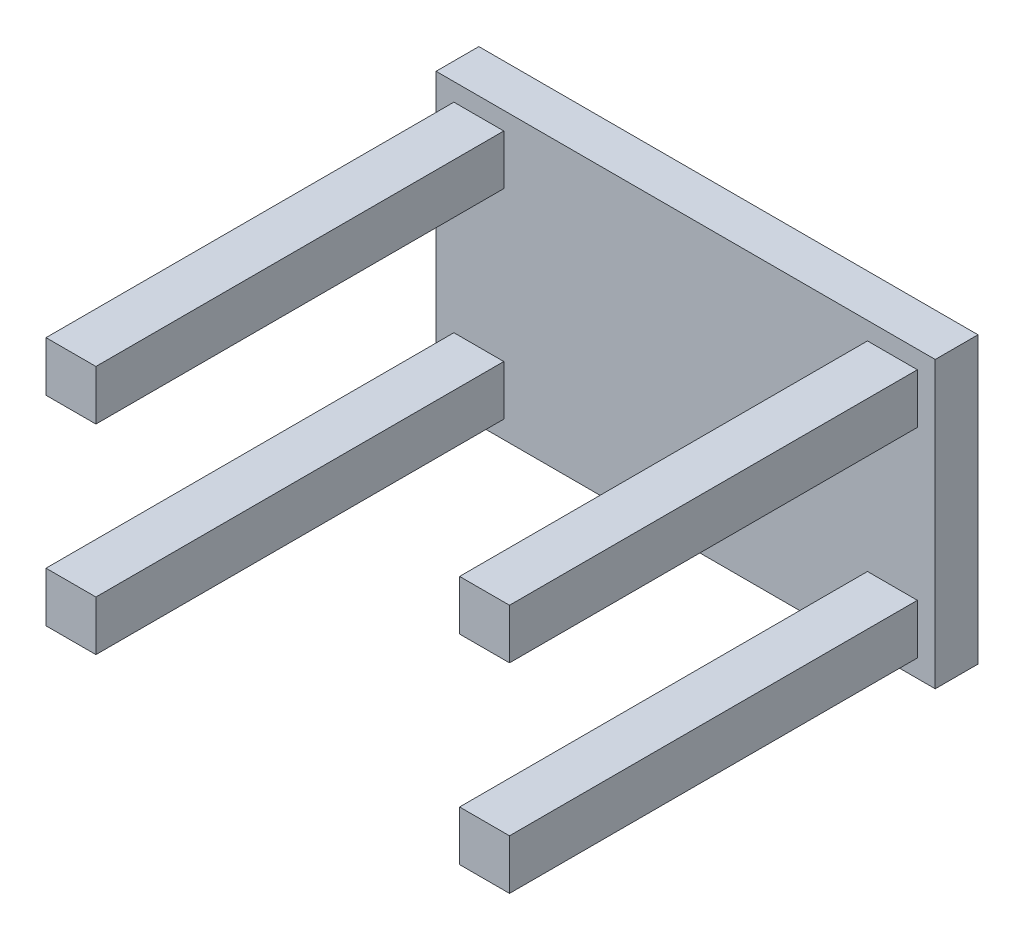
ISO-10303-21;
HEADER;
FILE_DESCRIPTION(('STEP AP214'),'2;1');
FILE_NAME('part.step','',(''),(''),'','','');
FILE_SCHEMA(('AUTOMOTIVE_DESIGN { 1 0 10303 214 1 1 1 1 }'));
ENDSEC;
DATA;
#1=APPLICATION_CONTEXT('core data for automotive mechanical design processes');
#2=APPLICATION_PROTOCOL_DEFINITION('international standard','automotive_design',2000,#1);
#3=PRODUCT_CONTEXT('',#1,'mechanical');
#4=PRODUCT('Part','Part','',(#3));
#5=PRODUCT_RELATED_PRODUCT_CATEGORY('part','',(#4));
#6=PRODUCT_DEFINITION_FORMATION('','',#4);
#7=PRODUCT_DEFINITION_CONTEXT('part definition',#1,'design');
#8=PRODUCT_DEFINITION('design','',#6,#7);
#9=PRODUCT_DEFINITION_SHAPE('','',#8);
#10=(LENGTH_UNIT() NAMED_UNIT(*) SI_UNIT(.MILLI.,.METRE.));
#11=(NAMED_UNIT(*) PLANE_ANGLE_UNIT() SI_UNIT($,.RADIAN.));
#12=(NAMED_UNIT(*) SI_UNIT($,.STERADIAN.) SOLID_ANGLE_UNIT());
#13=UNCERTAINTY_MEASURE_WITH_UNIT(LENGTH_MEASURE(1.E-05),#10,'distance_accuracy_value','');
#14=(GEOMETRIC_REPRESENTATION_CONTEXT(3) GLOBAL_UNCERTAINTY_ASSIGNED_CONTEXT((#13)) GLOBAL_UNIT_ASSIGNED_CONTEXT((#10,
#11,#12)) REPRESENTATION_CONTEXT('',''));
#15=CARTESIAN_POINT('',(0.,0.,0.));
#16=DIRECTION('',(0.,0.,1.));
#17=DIRECTION('',(1.,0.,0.));
#18=AXIS2_PLACEMENT_3D('',#15,#16,#17);
#19=CARTESIAN_POINT('',(0.,0.,30.));
#20=DIRECTION('',(0.,0.,-1.));
#21=DIRECTION('',(-1.,0.,0.));
#22=AXIS2_PLACEMENT_3D('',#19,#20,#21);
#23=PLANE('',#22);
#24=DIRECTION('',(0.,1.,0.));
#25=VECTOR('',#24,1.);
#26=CARTESIAN_POINT('',(-127.5,-87.5,30.));
#27=LINE('',#26,#25);
#28=CARTESIAN_POINT('',(-127.5,-87.5,30.));
#29=VERTEX_POINT('',#28);
#30=CARTESIAN_POINT('',(-127.5,-52.5,30.));
#31=VERTEX_POINT('',#30);
#32=EDGE_CURVE('E261',#29,#31,#27,.T.);
#33=ORIENTED_EDGE('',*,*,#32,.F.);
#34=DIRECTION('',(1.,0.,0.));
#35=VECTOR('',#34,1.);
#36=CARTESIAN_POINT('',(-162.5,-87.5,30.));
#37=LINE('',#36,#35);
#38=CARTESIAN_POINT('',(-162.5,-87.5,30.));
#39=VERTEX_POINT('',#38);
#40=EDGE_CURVE('E248',#39,#29,#37,.T.);
#41=ORIENTED_EDGE('',*,*,#40,.F.);
#42=DIRECTION('',(0.,-1.,0.));
#43=VECTOR('',#42,1.);
#44=CARTESIAN_POINT('',(-162.5,-87.5,30.));
#45=LINE('',#44,#43);
#46=CARTESIAN_POINT('',(-162.5,-52.5,30.));
#47=VERTEX_POINT('',#46);
#48=EDGE_CURVE('E252',#47,#39,#45,.T.);
#49=ORIENTED_EDGE('',*,*,#48,.F.);
#50=DIRECTION('',(-1.,0.,0.));
#51=VECTOR('',#50,1.);
#52=CARTESIAN_POINT('',(-162.5,-52.5,30.));
#53=LINE('',#52,#51);
#54=EDGE_CURVE('E257',#31,#47,#53,.T.);
#55=ORIENTED_EDGE('',*,*,#54,.F.);
#56=EDGE_LOOP('',(#33,#41,#49,#55));
#57=FACE_BOUND('',#56,.T.);
#58=DIRECTION('',(0.,1.,0.));
#59=VECTOR('',#58,1.);
#60=CARTESIAN_POINT('',(162.5,52.5,30.));
#61=LINE('',#60,#59);
#62=CARTESIAN_POINT('',(162.5,52.5,30.));
#63=VERTEX_POINT('',#62);
#64=CARTESIAN_POINT('',(162.5,87.5,30.));
#65=VERTEX_POINT('',#64);
#66=EDGE_CURVE('E191',#63,#65,#61,.T.);
#67=ORIENTED_EDGE('',*,*,#66,.F.);
#68=DIRECTION('',(1.,0.,0.));
#69=VECTOR('',#68,1.);
#70=CARTESIAN_POINT('',(127.5,52.5,30.));
#71=LINE('',#70,#69);
#72=CARTESIAN_POINT('',(127.5,52.5,30.));
#73=VERTEX_POINT('',#72);
#74=EDGE_CURVE('E321',#73,#63,#71,.T.);
#75=ORIENTED_EDGE('',*,*,#74,.F.);
#76=DIRECTION('',(0.,-1.,0.));
#77=VECTOR('',#76,1.);
#78=CARTESIAN_POINT('',(127.5,52.5,30.));
#79=LINE('',#78,#77);
#80=CARTESIAN_POINT('',(127.5,87.5,30.));
#81=VERTEX_POINT('',#80);
#82=EDGE_CURVE('E338',#81,#73,#79,.T.);
#83=ORIENTED_EDGE('',*,*,#82,.F.);
#84=DIRECTION('',(-1.,0.,0.));
#85=VECTOR('',#84,1.);
#86=CARTESIAN_POINT('',(127.5,87.5,30.));
#87=LINE('',#86,#85);
#88=EDGE_CURVE('E334',#65,#81,#87,.T.);
#89=ORIENTED_EDGE('',*,*,#88,.F.);
#90=EDGE_LOOP('',(#67,#75,#83,#89));
#91=FACE_BOUND('',#90,.T.);
#92=DIRECTION('',(0.,1.,0.));
#93=VECTOR('',#92,1.);
#94=CARTESIAN_POINT('',(175.,-100.,30.));
#95=LINE('',#94,#93);
#96=CARTESIAN_POINT('',(175.,-100.,30.));
#97=VERTEX_POINT('',#96);
#98=CARTESIAN_POINT('',(175.,100.,30.));
#99=VERTEX_POINT('',#98);
#100=EDGE_CURVE('E361',#97,#99,#95,.T.);
#101=ORIENTED_EDGE('',*,*,#100,.T.);
#102=DIRECTION('',(-1.,0.,0.));
#103=VECTOR('',#102,1.);
#104=CARTESIAN_POINT('',(-175.,100.,30.));
#105=LINE('',#104,#103);
#106=CARTESIAN_POINT('',(-175.,100.,30.));
#107=VERTEX_POINT('',#106);
#108=EDGE_CURVE('E365',#99,#107,#105,.T.);
#109=ORIENTED_EDGE('',*,*,#108,.T.);
#110=DIRECTION('',(0.,-1.,0.));
#111=VECTOR('',#110,1.);
#112=CARTESIAN_POINT('',(-175.,-100.,30.));
#113=LINE('',#112,#111);
#114=CARTESIAN_POINT('',(-175.,-100.,30.));
#115=VERTEX_POINT('',#114);
#116=EDGE_CURVE('E369',#107,#115,#113,.T.);
#117=ORIENTED_EDGE('',*,*,#116,.T.);
#118=DIRECTION('',(1.,0.,0.));
#119=VECTOR('',#118,1.);
#120=CARTESIAN_POINT('',(-175.,-100.,30.));
#121=LINE('',#120,#119);
#122=EDGE_CURVE('E372',#115,#97,#121,.T.);
#123=ORIENTED_EDGE('',*,*,#122,.T.);
#124=EDGE_LOOP('',(#101,#109,#117,#123));
#125=FACE_BOUND('',#124,.T.);
#126=DIRECTION('',(0.,1.,0.));
#127=VECTOR('',#126,1.);
#128=CARTESIAN_POINT('',(162.5,-87.5,30.));
#129=LINE('',#128,#127);
#130=CARTESIAN_POINT('',(162.5,-87.5,30.));
#131=VERTEX_POINT('',#130);
#132=CARTESIAN_POINT('',(162.5,-52.5,30.));
#133=VERTEX_POINT('',#132);
#134=EDGE_CURVE('E180',#131,#133,#129,.T.);
#135=ORIENTED_EDGE('',*,*,#134,.F.);
#136=DIRECTION('',(1.,0.,0.));
#137=VECTOR('',#136,1.);
#138=CARTESIAN_POINT('',(127.5,-87.5,30.));
#139=LINE('',#138,#137);
#140=CARTESIAN_POINT('',(127.5,-87.5,30.));
#141=VERTEX_POINT('',#140);
#142=EDGE_CURVE('E182',#141,#131,#139,.T.);
#143=ORIENTED_EDGE('',*,*,#142,.F.);
#144=DIRECTION('',(0.,-1.,0.));
#145=VECTOR('',#144,1.);
#146=CARTESIAN_POINT('',(127.5,-87.5,30.));
#147=LINE('',#146,#145);
#148=CARTESIAN_POINT('',(127.5,-52.5,30.));
#149=VERTEX_POINT('',#148);
#150=EDGE_CURVE('E203',#149,#141,#147,.T.);
#151=ORIENTED_EDGE('',*,*,#150,.F.);
#152=DIRECTION('',(-1.,0.,0.));
#153=VECTOR('',#152,1.);
#154=CARTESIAN_POINT('',(127.5,-52.5,30.));
#155=LINE('',#154,#153);
#156=EDGE_CURVE('E185',#133,#149,#155,.T.);
#157=ORIENTED_EDGE('',*,*,#156,.F.);
#158=EDGE_LOOP('',(#135,#143,#151,#157));
#159=FACE_BOUND('',#158,.T.);
#160=DIRECTION('',(0.,1.,0.));
#161=VECTOR('',#160,1.);
#162=CARTESIAN_POINT('',(-127.5,52.5,30.));
#163=LINE('',#162,#161);
#164=CARTESIAN_POINT('',(-127.5,52.5,30.));
#165=VERTEX_POINT('',#164);
#166=CARTESIAN_POINT('',(-127.5,87.5,30.));
#167=VERTEX_POINT('',#166);
#168=EDGE_CURVE('E235',#165,#167,#163,.T.);
#169=ORIENTED_EDGE('',*,*,#168,.F.);
#170=DIRECTION('',(1.,0.,0.));
#171=VECTOR('',#170,1.);
#172=CARTESIAN_POINT('',(-162.5,52.5,30.));
#173=LINE('',#172,#171);
#174=CARTESIAN_POINT('',(-162.5,52.5,30.));
#175=VERTEX_POINT('',#174);
#176=EDGE_CURVE('E293',#175,#165,#173,.T.);
#177=ORIENTED_EDGE('',*,*,#176,.F.);
#178=DIRECTION('',(0.,-1.,0.));
#179=VECTOR('',#178,1.);
#180=CARTESIAN_POINT('',(-162.5,52.5,30.));
#181=LINE('',#180,#179);
#182=CARTESIAN_POINT('',(-162.5,87.5,30.));
#183=VERTEX_POINT('',#182);
#184=EDGE_CURVE('E66',#183,#175,#181,.T.);
#185=ORIENTED_EDGE('',*,*,#184,.F.);
#186=DIRECTION('',(-1.,0.,0.));
#187=VECTOR('',#186,1.);
#188=CARTESIAN_POINT('',(-162.5,87.5,30.));
#189=LINE('',#188,#187);
#190=EDGE_CURVE('E61',#167,#183,#189,.T.);
#191=ORIENTED_EDGE('',*,*,#190,.F.);
#192=EDGE_LOOP('',(#169,#177,#185,#191));
#193=FACE_BOUND('',#192,.T.);
#194=ADVANCED_FACE('F45',(#57,#91,#125,#159,#193),#23,.F.);
#195=CARTESIAN_POINT('',(175.,-100.,30.));
#196=DIRECTION('',(-1.,0.,0.));
#197=DIRECTION('',(0.,0.,1.));
#198=AXIS2_PLACEMENT_3D('',#195,#196,#197);
#199=PLANE('',#198);
#200=DIRECTION('',(0.,1.,0.));
#201=VECTOR('',#200,1.);
#202=CARTESIAN_POINT('',(175.,-100.,0.));
#203=LINE('',#202,#201);
#204=CARTESIAN_POINT('',(175.,-100.,0.));
#205=VERTEX_POINT('',#204);
#206=CARTESIAN_POINT('',(175.,100.,0.));
#207=VERTEX_POINT('',#206);
#208=EDGE_CURVE('E360',#205,#207,#203,.T.);
#209=ORIENTED_EDGE('',*,*,#208,.T.);
#210=DIRECTION('',(0.,0.,-1.));
#211=VECTOR('',#210,1.);
#212=CARTESIAN_POINT('',(175.,100.,30.));
#213=LINE('',#212,#211);
#214=EDGE_CURVE('E11',#99,#207,#213,.T.);
#215=ORIENTED_EDGE('',*,*,#214,.F.);
#216=ORIENTED_EDGE('',*,*,#100,.F.);
#217=DIRECTION('',(0.,0.,-1.));
#218=VECTOR('',#217,1.);
#219=CARTESIAN_POINT('',(175.,-100.,30.));
#220=LINE('',#219,#218);
#221=EDGE_CURVE('E375',#97,#205,#220,.T.);
#222=ORIENTED_EDGE('',*,*,#221,.T.);
#223=EDGE_LOOP('',(#209,#215,#216,#222));
#224=FACE_BOUND('',#223,.T.);
#225=ADVANCED_FACE('F47',(#224),#199,.F.);
#226=CARTESIAN_POINT('',(-175.,100.,30.));
#227=DIRECTION('',(0.,-1.,0.));
#228=DIRECTION('',(0.,0.,-1.));
#229=AXIS2_PLACEMENT_3D('',#226,#227,#228);
#230=PLANE('',#229);
#231=DIRECTION('',(-1.,0.,0.));
#232=VECTOR('',#231,1.);
#233=CARTESIAN_POINT('',(-175.,100.,0.));
#234=LINE('',#233,#232);
#235=CARTESIAN_POINT('',(-175.,100.,0.));
#236=VERTEX_POINT('',#235);
#237=EDGE_CURVE('E379',#207,#236,#234,.T.);
#238=ORIENTED_EDGE('',*,*,#237,.T.);
#239=DIRECTION('',(0.,0.,-1.));
#240=VECTOR('',#239,1.);
#241=CARTESIAN_POINT('',(-175.,100.,30.));
#242=LINE('',#241,#240);
#243=EDGE_CURVE('E54',#107,#236,#242,.T.);
#244=ORIENTED_EDGE('',*,*,#243,.F.);
#245=ORIENTED_EDGE('',*,*,#108,.F.);
#246=ORIENTED_EDGE('',*,*,#214,.T.);
#247=EDGE_LOOP('',(#238,#244,#245,#246));
#248=FACE_BOUND('',#247,.T.);
#249=ADVANCED_FACE('F414',(#248),#230,.F.);
#250=CARTESIAN_POINT('',(-175.,-100.,30.));
#251=DIRECTION('',(1.,0.,0.));
#252=DIRECTION('',(0.,0.,-1.));
#253=AXIS2_PLACEMENT_3D('',#250,#251,#252);
#254=PLANE('',#253);
#255=DIRECTION('',(0.,-1.,0.));
#256=VECTOR('',#255,1.);
#257=CARTESIAN_POINT('',(-175.,-100.,0.));
#258=LINE('',#257,#256);
#259=CARTESIAN_POINT('',(-175.,-100.,0.));
#260=VERTEX_POINT('',#259);
#261=EDGE_CURVE('E382',#236,#260,#258,.T.);
#262=ORIENTED_EDGE('',*,*,#261,.T.);
#263=DIRECTION('',(0.,0.,-1.));
#264=VECTOR('',#263,1.);
#265=CARTESIAN_POINT('',(-175.,-100.,30.));
#266=LINE('',#265,#264);
#267=EDGE_CURVE('E390',#115,#260,#266,.T.);
#268=ORIENTED_EDGE('',*,*,#267,.F.);
#269=ORIENTED_EDGE('',*,*,#116,.F.);
#270=ORIENTED_EDGE('',*,*,#243,.T.);
#271=EDGE_LOOP('',(#262,#268,#269,#270));
#272=FACE_BOUND('',#271,.T.);
#273=ADVANCED_FACE('F399',(#272),#254,.F.);
#274=CARTESIAN_POINT('',(-175.,-100.,30.));
#275=DIRECTION('',(0.,1.,0.));
#276=DIRECTION('',(0.,0.,1.));
#277=AXIS2_PLACEMENT_3D('',#274,#275,#276);
#278=PLANE('',#277);
#279=DIRECTION('',(1.,0.,0.));
#280=VECTOR('',#279,1.);
#281=CARTESIAN_POINT('',(-175.,-100.,0.));
#282=LINE('',#281,#280);
#283=EDGE_CURVE('E366',#260,#205,#282,.T.);
#284=ORIENTED_EDGE('',*,*,#283,.T.);
#285=ORIENTED_EDGE('',*,*,#221,.F.);
#286=ORIENTED_EDGE('',*,*,#122,.F.);
#287=ORIENTED_EDGE('',*,*,#267,.T.);
#288=EDGE_LOOP('',(#284,#285,#286,#287));
#289=FACE_BOUND('',#288,.T.);
#290=ADVANCED_FACE('F408',(#289),#278,.F.);
#291=CARTESIAN_POINT('',(0.,0.,0.));
#292=DIRECTION('',(0.,0.,-1.));
#293=DIRECTION('',(-1.,0.,0.));
#294=AXIS2_PLACEMENT_3D('',#291,#292,#293);
#295=PLANE('',#294);
#296=ORIENTED_EDGE('',*,*,#208,.F.);
#297=ORIENTED_EDGE('',*,*,#283,.F.);
#298=ORIENTED_EDGE('',*,*,#261,.F.);
#299=ORIENTED_EDGE('',*,*,#237,.F.);
#300=EDGE_LOOP('',(#296,#297,#298,#299));
#301=FACE_BOUND('',#300,.T.);
#302=ADVANCED_FACE('F405',(#301),#295,.T.);
#303=CARTESIAN_POINT('',(162.5,52.5,316.));
#304=DIRECTION('',(-1.,0.,0.));
#305=DIRECTION('',(0.,0.,1.));
#306=AXIS2_PLACEMENT_3D('',#303,#304,#305);
#307=PLANE('',#306);
#308=ORIENTED_EDGE('',*,*,#66,.T.);
#309=DIRECTION('',(0.,0.,-1.));
#310=VECTOR('',#309,1.);
#311=CARTESIAN_POINT('',(162.5,87.5,316.));
#312=LINE('',#311,#310);
#313=CARTESIAN_POINT('',(162.5,87.5,316.));
#314=VERTEX_POINT('',#313);
#315=EDGE_CURVE('E356',#314,#65,#312,.T.);
#316=ORIENTED_EDGE('',*,*,#315,.F.);
#317=DIRECTION('',(0.,1.,0.));
#318=VECTOR('',#317,1.);
#319=CARTESIAN_POINT('',(162.5,52.5,316.));
#320=LINE('',#319,#318);
#321=CARTESIAN_POINT('',(162.5,52.5,316.));
#322=VERTEX_POINT('',#321);
#323=EDGE_CURVE('E316',#322,#314,#320,.T.);
#324=ORIENTED_EDGE('',*,*,#323,.F.);
#325=DIRECTION('',(0.,0.,-1.));
#326=VECTOR('',#325,1.);
#327=CARTESIAN_POINT('',(162.5,52.5,316.));
#328=LINE('',#327,#326);
#329=EDGE_CURVE('E330',#322,#63,#328,.T.);
#330=ORIENTED_EDGE('',*,*,#329,.T.);
#331=EDGE_LOOP('',(#308,#316,#324,#330));
#332=FACE_BOUND('',#331,.T.);
#333=ADVANCED_FACE('F431',(#332),#307,.F.);
#334=CARTESIAN_POINT('',(127.5,87.5,316.));
#335=DIRECTION('',(0.,-1.,0.));
#336=DIRECTION('',(0.,0.,-1.));
#337=AXIS2_PLACEMENT_3D('',#334,#335,#336);
#338=PLANE('',#337);
#339=ORIENTED_EDGE('',*,*,#88,.T.);
#340=DIRECTION('',(0.,0.,-1.));
#341=VECTOR('',#340,1.);
#342=CARTESIAN_POINT('',(127.5,87.5,316.));
#343=LINE('',#342,#341);
#344=CARTESIAN_POINT('',(127.5,87.5,316.));
#345=VERTEX_POINT('',#344);
#346=EDGE_CURVE('E352',#345,#81,#343,.T.);
#347=ORIENTED_EDGE('',*,*,#346,.F.);
#348=DIRECTION('',(-1.,0.,0.));
#349=VECTOR('',#348,1.);
#350=CARTESIAN_POINT('',(127.5,87.5,316.));
#351=LINE('',#350,#349);
#352=EDGE_CURVE('E320',#314,#345,#351,.T.);
#353=ORIENTED_EDGE('',*,*,#352,.F.);
#354=ORIENTED_EDGE('',*,*,#315,.T.);
#355=EDGE_LOOP('',(#339,#347,#353,#354));
#356=FACE_BOUND('',#355,.T.);
#357=ADVANCED_FACE('F457',(#356),#338,.F.);
#358=CARTESIAN_POINT('',(127.5,52.5,316.));
#359=DIRECTION('',(1.,0.,0.));
#360=DIRECTION('',(0.,0.,-1.));
#361=AXIS2_PLACEMENT_3D('',#358,#359,#360);
#362=PLANE('',#361);
#363=ORIENTED_EDGE('',*,*,#82,.T.);
#364=DIRECTION('',(0.,0.,-1.));
#365=VECTOR('',#364,1.);
#366=CARTESIAN_POINT('',(127.5,52.5,316.));
#367=LINE('',#366,#365);
#368=CARTESIAN_POINT('',(127.5,52.5,316.));
#369=VERTEX_POINT('',#368);
#370=EDGE_CURVE('E348',#369,#73,#367,.T.);
#371=ORIENTED_EDGE('',*,*,#370,.F.);
#372=DIRECTION('',(0.,-1.,0.));
#373=VECTOR('',#372,1.);
#374=CARTESIAN_POINT('',(127.5,52.5,316.));
#375=LINE('',#374,#373);
#376=EDGE_CURVE('E324',#345,#369,#375,.T.);
#377=ORIENTED_EDGE('',*,*,#376,.F.);
#378=ORIENTED_EDGE('',*,*,#346,.T.);
#379=EDGE_LOOP('',(#363,#371,#377,#378));
#380=FACE_BOUND('',#379,.T.);
#381=ADVANCED_FACE('F466',(#380),#362,.F.);
#382=CARTESIAN_POINT('',(127.5,52.5,316.));
#383=DIRECTION('',(0.,1.,0.));
#384=DIRECTION('',(0.,0.,1.));
#385=AXIS2_PLACEMENT_3D('',#382,#383,#384);
#386=PLANE('',#385);
#387=ORIENTED_EDGE('',*,*,#74,.T.);
#388=ORIENTED_EDGE('',*,*,#329,.F.);
#389=DIRECTION('',(1.,0.,0.));
#390=VECTOR('',#389,1.);
#391=CARTESIAN_POINT('',(127.5,52.5,316.));
#392=LINE('',#391,#390);
#393=EDGE_CURVE('E327',#369,#322,#392,.T.);
#394=ORIENTED_EDGE('',*,*,#393,.F.);
#395=ORIENTED_EDGE('',*,*,#370,.T.);
#396=EDGE_LOOP('',(#387,#388,#394,#395));
#397=FACE_BOUND('',#396,.T.);
#398=ADVANCED_FACE('F475',(#397),#386,.F.);
#399=CARTESIAN_POINT('',(0.,0.,316.));
#400=DIRECTION('',(0.,0.,-1.));
#401=DIRECTION('',(-1.,0.,0.));
#402=AXIS2_PLACEMENT_3D('',#399,#400,#401);
#403=PLANE('',#402);
#404=ORIENTED_EDGE('',*,*,#323,.T.);
#405=ORIENTED_EDGE('',*,*,#352,.T.);
#406=ORIENTED_EDGE('',*,*,#376,.T.);
#407=ORIENTED_EDGE('',*,*,#393,.T.);
#408=EDGE_LOOP('',(#404,#405,#406,#407));
#409=FACE_BOUND('',#408,.T.);
#410=ADVANCED_FACE('F485',(#409),#403,.F.);
#411=CARTESIAN_POINT('',(162.5,-87.5,316.));
#412=DIRECTION('',(-1.,0.,0.));
#413=DIRECTION('',(0.,0.,1.));
#414=AXIS2_PLACEMENT_3D('',#411,#412,#413);
#415=PLANE('',#414);
#416=ORIENTED_EDGE('',*,*,#134,.T.);
#417=DIRECTION('',(0.,0.,-1.));
#418=VECTOR('',#417,1.);
#419=CARTESIAN_POINT('',(162.5,-52.5,316.));
#420=LINE('',#419,#418);
#421=CARTESIAN_POINT('',(162.5,-52.5,316.));
#422=VERTEX_POINT('',#421);
#423=EDGE_CURVE('E265',#422,#133,#420,.T.);
#424=ORIENTED_EDGE('',*,*,#423,.F.);
#425=DIRECTION('',(0.,1.,0.));
#426=VECTOR('',#425,1.);
#427=CARTESIAN_POINT('',(162.5,-87.5,316.));
#428=LINE('',#427,#426);
#429=CARTESIAN_POINT('',(162.5,-87.5,316.));
#430=VERTEX_POINT('',#429);
#431=EDGE_CURVE('E204',#430,#422,#428,.T.);
#432=ORIENTED_EDGE('',*,*,#431,.F.);
#433=DIRECTION('',(0.,0.,-1.));
#434=VECTOR('',#433,1.);
#435=CARTESIAN_POINT('',(162.5,-87.5,316.));
#436=LINE('',#435,#434);
#437=EDGE_CURVE('E198',#430,#131,#436,.T.);
#438=ORIENTED_EDGE('',*,*,#437,.T.);
#439=EDGE_LOOP('',(#416,#424,#432,#438));
#440=FACE_BOUND('',#439,.T.);
#441=ADVANCED_FACE('F206',(#440),#415,.F.);
#442=CARTESIAN_POINT('',(127.5,-52.5,316.));
#443=DIRECTION('',(0.,-1.,0.));
#444=DIRECTION('',(0.,0.,-1.));
#445=AXIS2_PLACEMENT_3D('',#442,#443,#444);
#446=PLANE('',#445);
#447=ORIENTED_EDGE('',*,*,#156,.T.);
#448=DIRECTION('',(0.,0.,-1.));
#449=VECTOR('',#448,1.);
#450=CARTESIAN_POINT('',(127.5,-52.5,316.));
#451=LINE('',#450,#449);
#452=CARTESIAN_POINT('',(127.5,-52.5,316.));
#453=VERTEX_POINT('',#452);
#454=EDGE_CURVE('E215',#453,#149,#451,.T.);
#455=ORIENTED_EDGE('',*,*,#454,.F.);
#456=DIRECTION('',(-1.,0.,0.));
#457=VECTOR('',#456,1.);
#458=CARTESIAN_POINT('',(127.5,-52.5,316.));
#459=LINE('',#458,#457);
#460=EDGE_CURVE('E225',#422,#453,#459,.T.);
#461=ORIENTED_EDGE('',*,*,#460,.F.);
#462=ORIENTED_EDGE('',*,*,#423,.T.);
#463=EDGE_LOOP('',(#447,#455,#461,#462));
#464=FACE_BOUND('',#463,.T.);
#465=ADVANCED_FACE('F504',(#464),#446,.F.);
#466=CARTESIAN_POINT('',(127.5,-87.5,316.));
#467=DIRECTION('',(1.,0.,0.));
#468=DIRECTION('',(0.,0.,-1.));
#469=AXIS2_PLACEMENT_3D('',#466,#467,#468);
#470=PLANE('',#469);
#471=ORIENTED_EDGE('',*,*,#150,.T.);
#472=DIRECTION('',(0.,0.,-1.));
#473=VECTOR('',#472,1.);
#474=CARTESIAN_POINT('',(127.5,-87.5,316.));
#475=LINE('',#474,#473);
#476=CARTESIAN_POINT('',(127.5,-87.5,316.));
#477=VERTEX_POINT('',#476);
#478=EDGE_CURVE('E201',#477,#141,#475,.T.);
#479=ORIENTED_EDGE('',*,*,#478,.F.);
#480=DIRECTION('',(0.,-1.,0.));
#481=VECTOR('',#480,1.);
#482=CARTESIAN_POINT('',(127.5,-87.5,316.));
#483=LINE('',#482,#481);
#484=EDGE_CURVE('E213',#453,#477,#483,.T.);
#485=ORIENTED_EDGE('',*,*,#484,.F.);
#486=ORIENTED_EDGE('',*,*,#454,.T.);
#487=EDGE_LOOP('',(#471,#479,#485,#486));
#488=FACE_BOUND('',#487,.T.);
#489=ADVANCED_FACE('F513',(#488),#470,.F.);
#490=CARTESIAN_POINT('',(127.5,-87.5,316.));
#491=DIRECTION('',(0.,1.,0.));
#492=DIRECTION('',(0.,0.,1.));
#493=AXIS2_PLACEMENT_3D('',#490,#491,#492);
#494=PLANE('',#493);
#495=ORIENTED_EDGE('',*,*,#142,.T.);
#496=ORIENTED_EDGE('',*,*,#437,.F.);
#497=DIRECTION('',(1.,0.,0.));
#498=VECTOR('',#497,1.);
#499=CARTESIAN_POINT('',(127.5,-87.5,316.));
#500=LINE('',#499,#498);
#501=EDGE_CURVE('E209',#477,#430,#500,.T.);
#502=ORIENTED_EDGE('',*,*,#501,.F.);
#503=ORIENTED_EDGE('',*,*,#478,.T.);
#504=EDGE_LOOP('',(#495,#496,#502,#503));
#505=FACE_BOUND('',#504,.T.);
#506=ADVANCED_FACE('F196',(#505),#494,.F.);
#507=CARTESIAN_POINT('',(0.,0.,316.));
#508=DIRECTION('',(0.,0.,-1.));
#509=DIRECTION('',(-1.,0.,0.));
#510=AXIS2_PLACEMENT_3D('',#507,#508,#509);
#511=PLANE('',#510);
#512=ORIENTED_EDGE('',*,*,#431,.T.);
#513=ORIENTED_EDGE('',*,*,#460,.T.);
#514=ORIENTED_EDGE('',*,*,#484,.T.);
#515=ORIENTED_EDGE('',*,*,#501,.T.);
#516=EDGE_LOOP('',(#512,#513,#514,#515));
#517=FACE_BOUND('',#516,.T.);
#518=ADVANCED_FACE('F532',(#517),#511,.F.);
#519=CARTESIAN_POINT('',(-127.5,-87.5,316.));
#520=DIRECTION('',(-1.,0.,0.));
#521=DIRECTION('',(0.,0.,1.));
#522=AXIS2_PLACEMENT_3D('',#519,#520,#521);
#523=PLANE('',#522);
#524=ORIENTED_EDGE('',*,*,#32,.T.);
#525=DIRECTION('',(0.,0.,-1.));
#526=VECTOR('',#525,1.);
#527=CARTESIAN_POINT('',(-127.5,-52.5,316.));
#528=LINE('',#527,#526);
#529=CARTESIAN_POINT('',(-127.5,-52.5,316.));
#530=VERTEX_POINT('',#529);
#531=EDGE_CURVE('E230',#530,#31,#528,.T.);
#532=ORIENTED_EDGE('',*,*,#531,.F.);
#533=DIRECTION('',(0.,1.,0.));
#534=VECTOR('',#533,1.);
#535=CARTESIAN_POINT('',(-127.5,-87.5,316.));
#536=LINE('',#535,#534);
#537=CARTESIAN_POINT('',(-127.5,-87.5,316.));
#538=VERTEX_POINT('',#537);
#539=EDGE_CURVE('E253',#538,#530,#536,.T.);
#540=ORIENTED_EDGE('',*,*,#539,.F.);
#541=DIRECTION('',(0.,0.,-1.));
#542=VECTOR('',#541,1.);
#543=CARTESIAN_POINT('',(-127.5,-87.5,316.));
#544=LINE('',#543,#542);
#545=EDGE_CURVE('E243',#538,#29,#544,.T.);
#546=ORIENTED_EDGE('',*,*,#545,.T.);
#547=EDGE_LOOP('',(#524,#532,#540,#546));
#548=FACE_BOUND('',#547,.T.);
#549=ADVANCED_FACE('F541',(#548),#523,.F.);
#550=CARTESIAN_POINT('',(-162.5,-52.5,316.));
#551=DIRECTION('',(0.,-1.,0.));
#552=DIRECTION('',(0.,0.,-1.));
#553=AXIS2_PLACEMENT_3D('',#550,#551,#552);
#554=PLANE('',#553);
#555=ORIENTED_EDGE('',*,*,#54,.T.);
#556=DIRECTION('',(0.,0.,-1.));
#557=VECTOR('',#556,1.);
#558=CARTESIAN_POINT('',(-162.5,-52.5,316.));
#559=LINE('',#558,#557);
#560=CARTESIAN_POINT('',(-162.5,-52.5,316.));
#561=VERTEX_POINT('',#560);
#562=EDGE_CURVE('E234',#561,#47,#559,.T.);
#563=ORIENTED_EDGE('',*,*,#562,.F.);
#564=DIRECTION('',(-1.,0.,0.));
#565=VECTOR('',#564,1.);
#566=CARTESIAN_POINT('',(-162.5,-52.5,316.));
#567=LINE('',#566,#565);
#568=EDGE_CURVE('E271',#530,#561,#567,.T.);
#569=ORIENTED_EDGE('',*,*,#568,.F.);
#570=ORIENTED_EDGE('',*,*,#531,.T.);
#571=EDGE_LOOP('',(#555,#563,#569,#570));
#572=FACE_BOUND('',#571,.T.);
#573=ADVANCED_FACE('F551',(#572),#554,.F.);
#574=CARTESIAN_POINT('',(-162.5,-87.5,316.));
#575=DIRECTION('',(1.,0.,0.));
#576=DIRECTION('',(0.,0.,-1.));
#577=AXIS2_PLACEMENT_3D('',#574,#575,#576);
#578=PLANE('',#577);
#579=ORIENTED_EDGE('',*,*,#48,.T.);
#580=DIRECTION('',(0.,0.,-1.));
#581=VECTOR('',#580,1.);
#582=CARTESIAN_POINT('',(-162.5,-87.5,316.));
#583=LINE('',#582,#581);
#584=CARTESIAN_POINT('',(-162.5,-87.5,316.));
#585=VERTEX_POINT('',#584);
#586=EDGE_CURVE('E239',#585,#39,#583,.T.);
#587=ORIENTED_EDGE('',*,*,#586,.F.);
#588=DIRECTION('',(0.,-1.,0.));
#589=VECTOR('',#588,1.);
#590=CARTESIAN_POINT('',(-162.5,-87.5,316.));
#591=LINE('',#590,#589);
#592=EDGE_CURVE('E268',#561,#585,#591,.T.);
#593=ORIENTED_EDGE('',*,*,#592,.F.);
#594=ORIENTED_EDGE('',*,*,#562,.T.);
#595=EDGE_LOOP('',(#579,#587,#593,#594));
#596=FACE_BOUND('',#595,.T.);
#597=ADVANCED_FACE('F561',(#596),#578,.F.);
#598=CARTESIAN_POINT('',(-162.5,-87.5,316.));
#599=DIRECTION('',(0.,1.,0.));
#600=DIRECTION('',(0.,0.,1.));
#601=AXIS2_PLACEMENT_3D('',#598,#599,#600);
#602=PLANE('',#601);
#603=ORIENTED_EDGE('',*,*,#40,.T.);
#604=ORIENTED_EDGE('',*,*,#545,.F.);
#605=DIRECTION('',(1.,0.,0.));
#606=VECTOR('',#605,1.);
#607=CARTESIAN_POINT('',(-162.5,-87.5,316.));
#608=LINE('',#607,#606);
#609=EDGE_CURVE('E247',#585,#538,#608,.T.);
#610=ORIENTED_EDGE('',*,*,#609,.F.);
#611=ORIENTED_EDGE('',*,*,#586,.T.);
#612=EDGE_LOOP('',(#603,#604,#610,#611));
#613=FACE_BOUND('',#612,.T.);
#614=ADVANCED_FACE('F571',(#613),#602,.F.);
#615=CARTESIAN_POINT('',(0.,0.,316.));
#616=DIRECTION('',(0.,0.,-1.));
#617=DIRECTION('',(-1.,0.,0.));
#618=AXIS2_PLACEMENT_3D('',#615,#616,#617);
#619=PLANE('',#618);
#620=ORIENTED_EDGE('',*,*,#539,.T.);
#621=ORIENTED_EDGE('',*,*,#568,.T.);
#622=ORIENTED_EDGE('',*,*,#592,.T.);
#623=ORIENTED_EDGE('',*,*,#609,.T.);
#624=EDGE_LOOP('',(#620,#621,#622,#623));
#625=FACE_BOUND('',#624,.T.);
#626=ADVANCED_FACE('F581',(#625),#619,.F.);
#627=CARTESIAN_POINT('',(-127.5,52.5,316.));
#628=DIRECTION('',(-1.,0.,0.));
#629=DIRECTION('',(0.,0.,1.));
#630=AXIS2_PLACEMENT_3D('',#627,#628,#629);
#631=PLANE('',#630);
#632=ORIENTED_EDGE('',*,*,#168,.T.);
#633=DIRECTION('',(0.,0.,-1.));
#634=VECTOR('',#633,1.);
#635=CARTESIAN_POINT('',(-127.5,87.5,316.));
#636=LINE('',#635,#634);
#637=CARTESIAN_POINT('',(-127.5,87.5,316.));
#638=VERTEX_POINT('',#637);
#639=EDGE_CURVE('E277',#638,#167,#636,.T.);
#640=ORIENTED_EDGE('',*,*,#639,.F.);
#641=DIRECTION('',(0.,1.,0.));
#642=VECTOR('',#641,1.);
#643=CARTESIAN_POINT('',(-127.5,52.5,316.));
#644=LINE('',#643,#642);
#645=CARTESIAN_POINT('',(-127.5,52.5,316.));
#646=VERTEX_POINT('',#645);
#647=EDGE_CURVE('E297',#646,#638,#644,.T.);
#648=ORIENTED_EDGE('',*,*,#647,.F.);
#649=DIRECTION('',(0.,0.,-1.));
#650=VECTOR('',#649,1.);
#651=CARTESIAN_POINT('',(-127.5,52.5,316.));
#652=LINE('',#651,#650);
#653=EDGE_CURVE('E288',#646,#165,#652,.T.);
#654=ORIENTED_EDGE('',*,*,#653,.T.);
#655=EDGE_LOOP('',(#632,#640,#648,#654));
#656=FACE_BOUND('',#655,.T.);
#657=ADVANCED_FACE('F591',(#656),#631,.F.);
#658=CARTESIAN_POINT('',(-162.5,87.5,316.));
#659=DIRECTION('',(0.,-1.,0.));
#660=DIRECTION('',(0.,0.,-1.));
#661=AXIS2_PLACEMENT_3D('',#658,#659,#660);
#662=PLANE('',#661);
#663=ORIENTED_EDGE('',*,*,#190,.T.);
#664=DIRECTION('',(0.,0.,-1.));
#665=VECTOR('',#664,1.);
#666=CARTESIAN_POINT('',(-162.5,87.5,316.));
#667=LINE('',#666,#665);
#668=CARTESIAN_POINT('',(-162.5,87.5,316.));
#669=VERTEX_POINT('',#668);
#670=EDGE_CURVE('E280',#669,#183,#667,.T.);
#671=ORIENTED_EDGE('',*,*,#670,.F.);
#672=DIRECTION('',(-1.,0.,0.));
#673=VECTOR('',#672,1.);
#674=CARTESIAN_POINT('',(-162.5,87.5,316.));
#675=LINE('',#674,#673);
#676=EDGE_CURVE('E310',#638,#669,#675,.T.);
#677=ORIENTED_EDGE('',*,*,#676,.F.);
#678=ORIENTED_EDGE('',*,*,#639,.T.);
#679=EDGE_LOOP('',(#663,#671,#677,#678));
#680=FACE_BOUND('',#679,.T.);
#681=ADVANCED_FACE('F601',(#680),#662,.F.);
#682=CARTESIAN_POINT('',(-162.5,52.5,316.));
#683=DIRECTION('',(1.,0.,0.));
#684=DIRECTION('',(0.,0.,-1.));
#685=AXIS2_PLACEMENT_3D('',#682,#683,#684);
#686=PLANE('',#685);
#687=ORIENTED_EDGE('',*,*,#184,.T.);
#688=DIRECTION('',(0.,0.,-1.));
#689=VECTOR('',#688,1.);
#690=CARTESIAN_POINT('',(-162.5,52.5,316.));
#691=LINE('',#690,#689);
#692=CARTESIAN_POINT('',(-162.5,52.5,316.));
#693=VERTEX_POINT('',#692);
#694=EDGE_CURVE('E284',#693,#175,#691,.T.);
#695=ORIENTED_EDGE('',*,*,#694,.F.);
#696=DIRECTION('',(0.,-1.,0.));
#697=VECTOR('',#696,1.);
#698=CARTESIAN_POINT('',(-162.5,52.5,316.));
#699=LINE('',#698,#697);
#700=EDGE_CURVE('E307',#669,#693,#699,.T.);
#701=ORIENTED_EDGE('',*,*,#700,.F.);
#702=ORIENTED_EDGE('',*,*,#670,.T.);
#703=EDGE_LOOP('',(#687,#695,#701,#702));
#704=FACE_BOUND('',#703,.T.);
#705=ADVANCED_FACE('F611',(#704),#686,.F.);
#706=CARTESIAN_POINT('',(-162.5,52.5,316.));
#707=DIRECTION('',(0.,1.,0.));
#708=DIRECTION('',(0.,0.,1.));
#709=AXIS2_PLACEMENT_3D('',#706,#707,#708);
#710=PLANE('',#709);
#711=ORIENTED_EDGE('',*,*,#176,.T.);
#712=ORIENTED_EDGE('',*,*,#653,.F.);
#713=DIRECTION('',(1.,0.,0.));
#714=VECTOR('',#713,1.);
#715=CARTESIAN_POINT('',(-162.5,52.5,316.));
#716=LINE('',#715,#714);
#717=EDGE_CURVE('E292',#693,#646,#716,.T.);
#718=ORIENTED_EDGE('',*,*,#717,.F.);
#719=ORIENTED_EDGE('',*,*,#694,.T.);
#720=EDGE_LOOP('',(#711,#712,#718,#719));
#721=FACE_BOUND('',#720,.T.);
#722=ADVANCED_FACE('F621',(#721),#710,.F.);
#723=CARTESIAN_POINT('',(0.,0.,316.));
#724=DIRECTION('',(0.,0.,-1.));
#725=DIRECTION('',(-1.,0.,0.));
#726=AXIS2_PLACEMENT_3D('',#723,#724,#725);
#727=PLANE('',#726);
#728=ORIENTED_EDGE('',*,*,#647,.T.);
#729=ORIENTED_EDGE('',*,*,#676,.T.);
#730=ORIENTED_EDGE('',*,*,#700,.T.);
#731=ORIENTED_EDGE('',*,*,#717,.T.);
#732=EDGE_LOOP('',(#728,#729,#730,#731));
#733=FACE_BOUND('',#732,.T.);
#734=ADVANCED_FACE('F631',(#733),#727,.F.);
#735=CLOSED_SHELL('',(#194,#225,#249,#273,#290,#302,#333,#357,#381,#398,#410,#441,#465,#489,
#506,#518,#549,#573,#597,#614,#626,#657,#681,#705,#722,#734));
#736=MANIFOLD_SOLID_BREP('B2',#735);
#737=ADVANCED_BREP_SHAPE_REPRESENTATION('',(#18,#736),#14);
#738=SHAPE_DEFINITION_REPRESENTATION(#9,#737);
ENDSEC;
END-ISO-10303-21;
